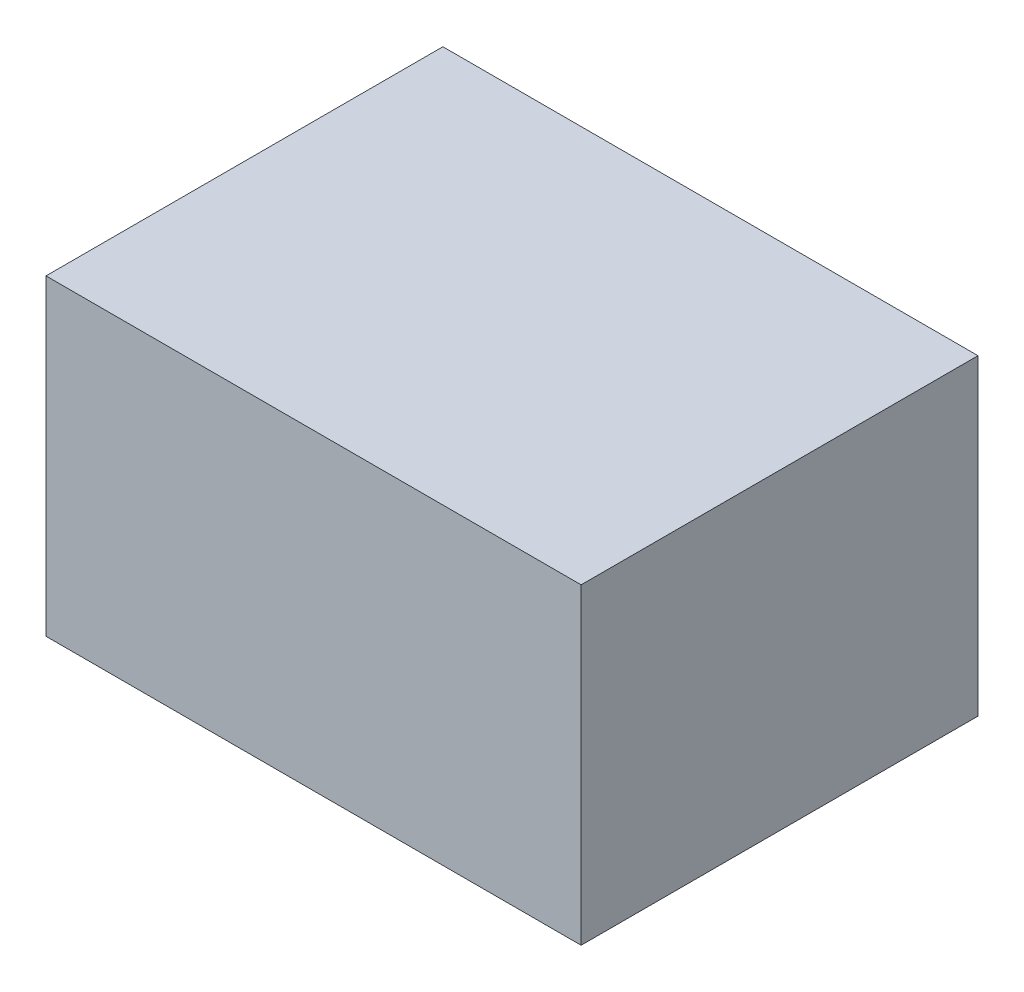
ISO-10303-21;
HEADER;
FILE_DESCRIPTION(('STEP AP214'),'2;1');
FILE_NAME('part.step','',(''),(''),'','','');
FILE_SCHEMA(('AUTOMOTIVE_DESIGN { 1 0 10303 214 1 1 1 1 }'));
ENDSEC;
DATA;
#1=APPLICATION_CONTEXT('core data for automotive mechanical design processes');
#2=APPLICATION_PROTOCOL_DEFINITION('international standard','automotive_design',2000,#1);
#3=PRODUCT_CONTEXT('',#1,'mechanical');
#4=PRODUCT('Part','Part','',(#3));
#5=PRODUCT_RELATED_PRODUCT_CATEGORY('part','',(#4));
#6=PRODUCT_DEFINITION_FORMATION('','',#4);
#7=PRODUCT_DEFINITION_CONTEXT('part definition',#1,'design');
#8=PRODUCT_DEFINITION('design','',#6,#7);
#9=PRODUCT_DEFINITION_SHAPE('','',#8);
#10=(LENGTH_UNIT() NAMED_UNIT(*) SI_UNIT(.MILLI.,.METRE.));
#11=(NAMED_UNIT(*) PLANE_ANGLE_UNIT() SI_UNIT($,.RADIAN.));
#12=(NAMED_UNIT(*) SI_UNIT($,.STERADIAN.) SOLID_ANGLE_UNIT());
#13=UNCERTAINTY_MEASURE_WITH_UNIT(LENGTH_MEASURE(1.E-05),#10,'distance_accuracy_value','');
#14=(GEOMETRIC_REPRESENTATION_CONTEXT(3) GLOBAL_UNCERTAINTY_ASSIGNED_CONTEXT((#13)) GLOBAL_UNIT_ASSIGNED_CONTEXT((#10,
#11,#12)) REPRESENTATION_CONTEXT('',''));
#15=CARTESIAN_POINT('',(0.,0.,0.));
#16=DIRECTION('',(0.,0.,1.));
#17=DIRECTION('',(1.,0.,0.));
#18=AXIS2_PLACEMENT_3D('',#15,#16,#17);
#19=CARTESIAN_POINT('',(0.,0.,-445.));
#20=DIRECTION('',(-1.,0.,0.));
#21=DIRECTION('',(0.,0.,1.));
#22=AXIS2_PLACEMENT_3D('',#19,#20,#21);
#23=PLANE('',#22);
#24=DIRECTION('',(0.,-1.,0.));
#25=VECTOR('',#24,1.);
#26=CARTESIAN_POINT('',(0.,0.,0.));
#27=LINE('',#26,#25);
#28=CARTESIAN_POINT('',(0.,350.,0.));
#29=VERTEX_POINT('',#28);
#30=CARTESIAN_POINT('',(0.,0.,0.));
#31=VERTEX_POINT('',#30);
#32=EDGE_CURVE('E101',#29,#31,#27,.T.);
#33=ORIENTED_EDGE('',*,*,#32,.F.);
#34=DIRECTION('',(0.,0.,1.));
#35=VECTOR('',#34,1.);
#36=CARTESIAN_POINT('',(0.,350.,-445.));
#37=LINE('',#36,#35);
#38=CARTESIAN_POINT('',(0.,350.,-445.));
#39=VERTEX_POINT('',#38);
#40=EDGE_CURVE('E11',#39,#29,#37,.T.);
#41=ORIENTED_EDGE('',*,*,#40,.F.);
#42=DIRECTION('',(0.,-1.,0.));
#43=VECTOR('',#42,1.);
#44=CARTESIAN_POINT('',(0.,0.,-445.));
#45=LINE('',#44,#43);
#46=CARTESIAN_POINT('',(0.,0.,-445.));
#47=VERTEX_POINT('',#46);
#48=EDGE_CURVE('E95',#39,#47,#45,.T.);
#49=ORIENTED_EDGE('',*,*,#48,.T.);
#50=DIRECTION('',(0.,0.,1.));
#51=VECTOR('',#50,1.);
#52=CARTESIAN_POINT('',(0.,0.,-445.));
#53=LINE('',#52,#51);
#54=EDGE_CURVE('E40',#47,#31,#53,.T.);
#55=ORIENTED_EDGE('',*,*,#54,.T.);
#56=EDGE_LOOP('',(#33,#41,#49,#55));
#57=FACE_BOUND('',#56,.T.);
#58=ADVANCED_FACE('F37',(#57),#23,.T.);
#59=CARTESIAN_POINT('',(0.,350.,-445.));
#60=DIRECTION('',(0.,1.,0.));
#61=DIRECTION('',(0.,0.,1.));
#62=AXIS2_PLACEMENT_3D('',#59,#60,#61);
#63=PLANE('',#62);
#64=DIRECTION('',(-1.,0.,0.));
#65=VECTOR('',#64,1.);
#66=CARTESIAN_POINT('',(0.,350.,0.));
#67=LINE('',#66,#65);
#68=CARTESIAN_POINT('',(600.,350.,0.));
#69=VERTEX_POINT('',#68);
#70=EDGE_CURVE('E97',#69,#29,#67,.T.);
#71=ORIENTED_EDGE('',*,*,#70,.F.);
#72=DIRECTION('',(0.,0.,1.));
#73=VECTOR('',#72,1.);
#74=CARTESIAN_POINT('',(600.,350.,-445.));
#75=LINE('',#74,#73);
#76=CARTESIAN_POINT('',(600.,350.,-445.));
#77=VERTEX_POINT('',#76);
#78=EDGE_CURVE('E46',#77,#69,#75,.T.);
#79=ORIENTED_EDGE('',*,*,#78,.F.);
#80=DIRECTION('',(-1.,0.,0.));
#81=VECTOR('',#80,1.);
#82=CARTESIAN_POINT('',(0.,350.,-445.));
#83=LINE('',#82,#81);
#84=EDGE_CURVE('E92',#77,#39,#83,.T.);
#85=ORIENTED_EDGE('',*,*,#84,.T.);
#86=ORIENTED_EDGE('',*,*,#40,.T.);
#87=EDGE_LOOP('',(#71,#79,#85,#86));
#88=FACE_BOUND('',#87,.T.);
#89=ADVANCED_FACE('F111',(#88),#63,.T.);
#90=CARTESIAN_POINT('',(600.,0.,-445.));
#91=DIRECTION('',(1.,0.,0.));
#92=DIRECTION('',(0.,0.,-1.));
#93=AXIS2_PLACEMENT_3D('',#90,#91,#92);
#94=PLANE('',#93);
#95=DIRECTION('',(0.,1.,0.));
#96=VECTOR('',#95,1.);
#97=CARTESIAN_POINT('',(600.,0.,0.));
#98=LINE('',#97,#96);
#99=CARTESIAN_POINT('',(600.,0.,0.));
#100=VERTEX_POINT('',#99);
#101=EDGE_CURVE('E87',#100,#69,#98,.T.);
#102=ORIENTED_EDGE('',*,*,#101,.F.);
#103=DIRECTION('',(0.,0.,1.));
#104=VECTOR('',#103,1.);
#105=CARTESIAN_POINT('',(600.,0.,-445.));
#106=LINE('',#105,#104);
#107=CARTESIAN_POINT('',(600.,0.,-445.));
#108=VERTEX_POINT('',#107);
#109=EDGE_CURVE('E82',#108,#100,#106,.T.);
#110=ORIENTED_EDGE('',*,*,#109,.F.);
#111=DIRECTION('',(0.,1.,0.));
#112=VECTOR('',#111,1.);
#113=CARTESIAN_POINT('',(600.,0.,-445.));
#114=LINE('',#113,#112);
#115=EDGE_CURVE('E85',#108,#77,#114,.T.);
#116=ORIENTED_EDGE('',*,*,#115,.T.);
#117=ORIENTED_EDGE('',*,*,#78,.T.);
#118=EDGE_LOOP('',(#102,#110,#116,#117));
#119=FACE_BOUND('',#118,.T.);
#120=ADVANCED_FACE('F84',(#119),#94,.T.);
#121=CARTESIAN_POINT('',(0.,0.,-445.));
#122=DIRECTION('',(0.,-1.,0.));
#123=DIRECTION('',(0.,0.,-1.));
#124=AXIS2_PLACEMENT_3D('',#121,#122,#123);
#125=PLANE('',#124);
#126=DIRECTION('',(1.,0.,0.));
#127=VECTOR('',#126,1.);
#128=CARTESIAN_POINT('',(0.,0.,0.));
#129=LINE('',#128,#127);
#130=EDGE_CURVE('E104',#31,#100,#129,.T.);
#131=ORIENTED_EDGE('',*,*,#130,.F.);
#132=ORIENTED_EDGE('',*,*,#54,.F.);
#133=DIRECTION('',(1.,0.,0.));
#134=VECTOR('',#133,1.);
#135=CARTESIAN_POINT('',(0.,0.,-445.));
#136=LINE('',#135,#134);
#137=EDGE_CURVE('E91',#47,#108,#136,.T.);
#138=ORIENTED_EDGE('',*,*,#137,.T.);
#139=ORIENTED_EDGE('',*,*,#109,.T.);
#140=EDGE_LOOP('',(#131,#132,#138,#139));
#141=FACE_BOUND('',#140,.T.);
#142=ADVANCED_FACE('F94',(#141),#125,.T.);
#143=CARTESIAN_POINT('',(0.,0.,-445.));
#144=DIRECTION('',(0.,0.,-1.));
#145=DIRECTION('',(-1.,0.,0.));
#146=AXIS2_PLACEMENT_3D('',#143,#144,#145);
#147=PLANE('',#146);
#148=ORIENTED_EDGE('',*,*,#48,.F.);
#149=ORIENTED_EDGE('',*,*,#84,.F.);
#150=ORIENTED_EDGE('',*,*,#115,.F.);
#151=ORIENTED_EDGE('',*,*,#137,.F.);
#152=EDGE_LOOP('',(#148,#149,#150,#151));
#153=FACE_BOUND('',#152,.T.);
#154=ADVANCED_FACE('F90',(#153),#147,.T.);
#155=CARTESIAN_POINT('',(0.,0.,0.));
#156=DIRECTION('',(0.,0.,-1.));
#157=DIRECTION('',(-1.,0.,0.));
#158=AXIS2_PLACEMENT_3D('',#155,#156,#157);
#159=PLANE('',#158);
#160=ORIENTED_EDGE('',*,*,#32,.T.);
#161=ORIENTED_EDGE('',*,*,#130,.T.);
#162=ORIENTED_EDGE('',*,*,#101,.T.);
#163=ORIENTED_EDGE('',*,*,#70,.T.);
#164=EDGE_LOOP('',(#160,#161,#162,#163));
#165=FACE_BOUND('',#164,.T.);
#166=ADVANCED_FACE('F110',(#165),#159,.F.);
#167=CLOSED_SHELL('',(#58,#89,#120,#142,#154,#166));
#168=MANIFOLD_SOLID_BREP('B2',#167);
#169=ADVANCED_BREP_SHAPE_REPRESENTATION('',(#18,#168),#14);
#170=SHAPE_DEFINITION_REPRESENTATION(#9,#169);
ENDSEC;
END-ISO-10303-21;
